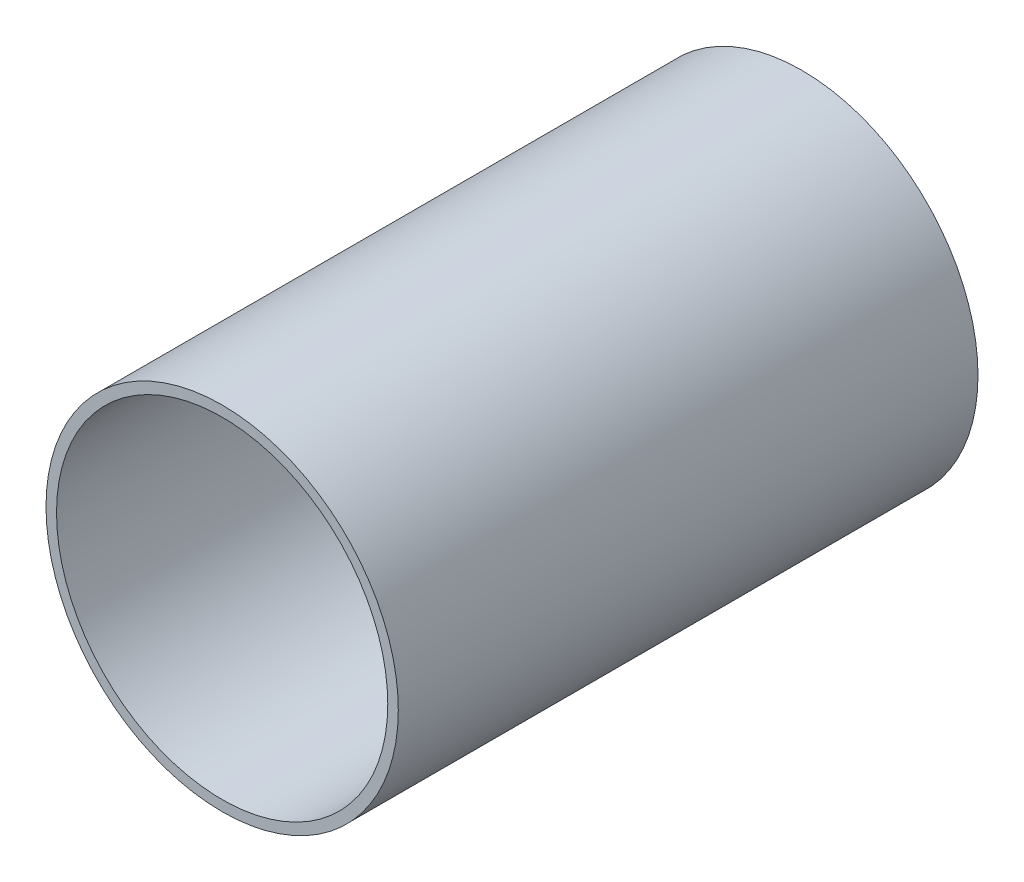
ISO-10303-21;
HEADER;
FILE_DESCRIPTION(('STEP AP214'),'2;1');
FILE_NAME('part.step','',(''),(''),'','','');
FILE_SCHEMA(('AUTOMOTIVE_DESIGN { 1 0 10303 214 1 1 1 1 }'));
ENDSEC;
DATA;
#1=APPLICATION_CONTEXT('core data for automotive mechanical design processes');
#2=APPLICATION_PROTOCOL_DEFINITION('international standard','automotive_design',2000,#1);
#3=PRODUCT_CONTEXT('',#1,'mechanical');
#4=PRODUCT('Part','Part','',(#3));
#5=PRODUCT_RELATED_PRODUCT_CATEGORY('part','',(#4));
#6=PRODUCT_DEFINITION_FORMATION('','',#4);
#7=PRODUCT_DEFINITION_CONTEXT('part definition',#1,'design');
#8=PRODUCT_DEFINITION('design','',#6,#7);
#9=PRODUCT_DEFINITION_SHAPE('','',#8);
#10=(LENGTH_UNIT() NAMED_UNIT(*) SI_UNIT(.MILLI.,.METRE.));
#11=(NAMED_UNIT(*) PLANE_ANGLE_UNIT() SI_UNIT($,.RADIAN.));
#12=(NAMED_UNIT(*) SI_UNIT($,.STERADIAN.) SOLID_ANGLE_UNIT());
#13=UNCERTAINTY_MEASURE_WITH_UNIT(LENGTH_MEASURE(1.E-05),#10,'distance_accuracy_value','');
#14=(GEOMETRIC_REPRESENTATION_CONTEXT(3) GLOBAL_UNCERTAINTY_ASSIGNED_CONTEXT((#13)) GLOBAL_UNIT_ASSIGNED_CONTEXT((#10,
#11,#12)) REPRESENTATION_CONTEXT('',''));
#15=CARTESIAN_POINT('',(0.,0.,0.));
#16=DIRECTION('',(0.,0.,1.));
#17=DIRECTION('',(1.,0.,0.));
#18=AXIS2_PLACEMENT_3D('',#15,#16,#17);
#19=CARTESIAN_POINT('',(0.,0.,0.));
#20=DIRECTION('',(0.,0.,-1.));
#21=DIRECTION('',(1.,0.,0.));
#22=AXIS2_PLACEMENT_3D('',#19,#20,#21);
#23=CYLINDRICAL_SURFACE('',#22,0.4253992);
#24=CARTESIAN_POINT('',(0.,0.,1.39999974));
#25=DIRECTION('',(0.,0.,1.));
#26=DIRECTION('',(1.,0.,0.));
#27=AXIS2_PLACEMENT_3D('',#24,#25,#26);
#28=CIRCLE('',#27,0.4253992);
#29=CARTESIAN_POINT('',(0.4253992,0.,1.39999974));
#30=VERTEX_POINT('',#29);
#31=EDGE_CURVE('E11',#30,#30,#28,.T.);
#32=ORIENTED_EDGE('',*,*,#31,.F.);
#33=DIRECTION('',(0.,0.,1.));
#34=VECTOR('',#33,1.);
#35=CARTESIAN_POINT('',(0.4253992,0.,0.));
#36=LINE('',#35,#34);
#37=CARTESIAN_POINT('',(0.4253992,0.,0.));
#38=VERTEX_POINT('',#37);
#39=EDGE_CURVE('E24',#38,#30,#36,.T.);
#40=ORIENTED_EDGE('',*,*,#39,.F.);
#41=CARTESIAN_POINT('',(0.,0.,0.));
#42=DIRECTION('',(0.,0.,1.));
#43=DIRECTION('',(1.,0.,0.));
#44=AXIS2_PLACEMENT_3D('',#41,#42,#43);
#45=CIRCLE('',#44,0.4253992);
#46=EDGE_CURVE('E46',#38,#38,#45,.T.);
#47=ORIENTED_EDGE('',*,*,#46,.T.);
#48=ORIENTED_EDGE('',*,*,#39,.T.);
#49=EDGE_LOOP('',(#32,#40,#47,#48));
#50=FACE_BOUND('',#49,.T.);
#51=ADVANCED_FACE('F17',(#50),#23,.T.);
#52=CARTESIAN_POINT('',(0.,0.,0.));
#53=DIRECTION('',(0.,0.,-1.));
#54=DIRECTION('',(1.,0.,0.));
#55=AXIS2_PLACEMENT_3D('',#52,#53,#54);
#56=CYLINDRICAL_SURFACE('',#55,0.3999992);
#57=DIRECTION('',(0.,0.,1.));
#58=VECTOR('',#57,1.);
#59=CARTESIAN_POINT('',(0.3999992,0.,0.));
#60=LINE('',#59,#58);
#61=CARTESIAN_POINT('',(0.3999992,0.,0.));
#62=VERTEX_POINT('',#61);
#63=CARTESIAN_POINT('',(0.3999992,0.,1.39999974));
#64=VERTEX_POINT('',#63);
#65=EDGE_CURVE('E40',#62,#64,#60,.T.);
#66=ORIENTED_EDGE('',*,*,#65,.T.);
#67=CARTESIAN_POINT('',(0.,0.,1.39999974));
#68=DIRECTION('',(0.,0.,1.));
#69=DIRECTION('',(1.,0.,0.));
#70=AXIS2_PLACEMENT_3D('',#67,#68,#69);
#71=CIRCLE('',#70,0.3999992);
#72=EDGE_CURVE('E45',#64,#64,#71,.T.);
#73=ORIENTED_EDGE('',*,*,#72,.T.);
#74=ORIENTED_EDGE('',*,*,#65,.F.);
#75=CARTESIAN_POINT('',(0.,0.,0.));
#76=DIRECTION('',(0.,0.,1.));
#77=DIRECTION('',(1.,0.,0.));
#78=AXIS2_PLACEMENT_3D('',#75,#76,#77);
#79=CIRCLE('',#78,0.3999992);
#80=EDGE_CURVE('E43',#62,#62,#79,.T.);
#81=ORIENTED_EDGE('',*,*,#80,.F.);
#82=EDGE_LOOP('',(#66,#73,#74,#81));
#83=FACE_BOUND('',#82,.T.);
#84=ADVANCED_FACE('F42',(#83),#56,.F.);
#85=CARTESIAN_POINT('',(0.4253992,0.,0.));
#86=DIRECTION('',(0.,0.,-1.));
#87=DIRECTION('',(-1.,0.,0.));
#88=AXIS2_PLACEMENT_3D('',#85,#86,#87);
#89=PLANE('',#88);
#90=ORIENTED_EDGE('',*,*,#46,.F.);
#91=EDGE_LOOP('',(#90));
#92=FACE_BOUND('',#91,.T.);
#93=ORIENTED_EDGE('',*,*,#80,.T.);
#94=EDGE_LOOP('',(#93));
#95=FACE_BOUND('',#94,.T.);
#96=ADVANCED_FACE('F49',(#92,#95),#89,.T.);
#97=CARTESIAN_POINT('',(0.4253992,0.,1.39999974));
#98=DIRECTION('',(0.,0.,-1.));
#99=DIRECTION('',(-1.,0.,0.));
#100=AXIS2_PLACEMENT_3D('',#97,#98,#99);
#101=PLANE('',#100);
#102=ORIENTED_EDGE('',*,*,#31,.T.);
#103=EDGE_LOOP('',(#102));
#104=FACE_BOUND('',#103,.T.);
#105=ORIENTED_EDGE('',*,*,#72,.F.);
#106=EDGE_LOOP('',(#105));
#107=FACE_BOUND('',#106,.T.);
#108=ADVANCED_FACE('F56',(#104,#107),#101,.F.);
#109=CLOSED_SHELL('',(#51,#84,#96,#108));
#110=MANIFOLD_SOLID_BREP('B1',#109);
#111=ADVANCED_BREP_SHAPE_REPRESENTATION('',(#18,#110),#14);
#112=SHAPE_DEFINITION_REPRESENTATION(#9,#111);
ENDSEC;
END-ISO-10303-21;
